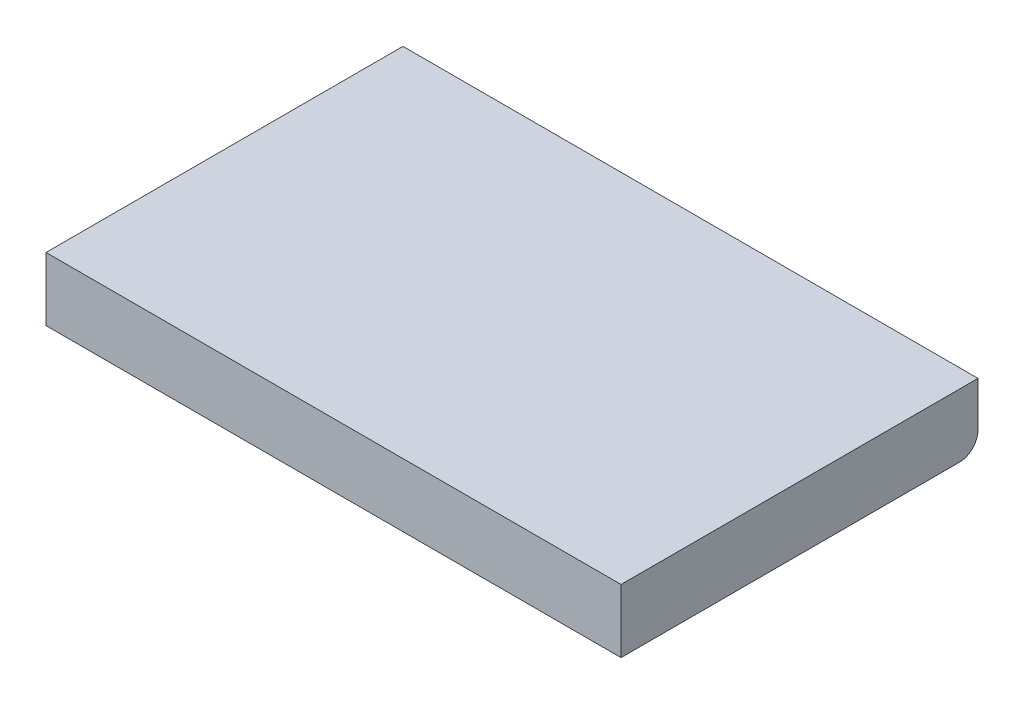
ISO-10303-21;
HEADER;
FILE_DESCRIPTION(('STEP AP214'),'2;1');
FILE_NAME('part.step','',(''),(''),'','','');
FILE_SCHEMA(('AUTOMOTIVE_DESIGN { 1 0 10303 214 1 1 1 1 }'));
ENDSEC;
DATA;
#1=APPLICATION_CONTEXT('core data for automotive mechanical design processes');
#2=APPLICATION_PROTOCOL_DEFINITION('international standard','automotive_design',2000,#1);
#3=PRODUCT_CONTEXT('',#1,'mechanical');
#4=PRODUCT('Part','Part','',(#3));
#5=PRODUCT_RELATED_PRODUCT_CATEGORY('part','',(#4));
#6=PRODUCT_DEFINITION_FORMATION('','',#4);
#7=PRODUCT_DEFINITION_CONTEXT('part definition',#1,'design');
#8=PRODUCT_DEFINITION('design','',#6,#7);
#9=PRODUCT_DEFINITION_SHAPE('','',#8);
#10=(LENGTH_UNIT() NAMED_UNIT(*) SI_UNIT(.MILLI.,.METRE.));
#11=(NAMED_UNIT(*) PLANE_ANGLE_UNIT() SI_UNIT($,.RADIAN.));
#12=(NAMED_UNIT(*) SI_UNIT($,.STERADIAN.) SOLID_ANGLE_UNIT());
#13=UNCERTAINTY_MEASURE_WITH_UNIT(LENGTH_MEASURE(1.E-05),#10,'distance_accuracy_value','');
#14=(GEOMETRIC_REPRESENTATION_CONTEXT(3) GLOBAL_UNCERTAINTY_ASSIGNED_CONTEXT((#13)) GLOBAL_UNIT_ASSIGNED_CONTEXT((#10,
#11,#12)) REPRESENTATION_CONTEXT('',''));
#15=CARTESIAN_POINT('',(0.,0.,0.));
#16=DIRECTION('',(0.,0.,1.));
#17=DIRECTION('',(1.,0.,0.));
#18=AXIS2_PLACEMENT_3D('',#15,#16,#17);
#19=CARTESIAN_POINT('',(0.,0.,0.));
#20=DIRECTION('',(0.,1.,0.));
#21=DIRECTION('',(0.,0.,1.));
#22=AXIS2_PLACEMENT_3D('',#19,#20,#21);
#23=PLANE('',#22);
#24=DIRECTION('',(-1.,0.,0.));
#25=VECTOR('',#24,1.);
#26=CARTESIAN_POINT('',(-72.750000042,0.,42.749999971));
#27=LINE('',#26,#25);
#28=CARTESIAN_POINT('',(72.750000042,0.,42.749999971));
#29=VERTEX_POINT('',#28);
#30=CARTESIAN_POINT('',(-72.750000042,0.,42.749999971));
#31=VERTEX_POINT('',#30);
#32=EDGE_CURVE('E207',#29,#31,#27,.T.);
#33=ORIENTED_EDGE('',*,*,#32,.T.);
#34=DIRECTION('',(0.,0.,-1.));
#35=VECTOR('',#34,1.);
#36=CARTESIAN_POINT('',(-72.750000042,0.,49.099999971));
#37=LINE('',#36,#35);
#38=CARTESIAN_POINT('',(-72.750000042,0.,-49.100002066488));
#39=VERTEX_POINT('',#38);
#40=EDGE_CURVE('E195',#31,#39,#37,.T.);
#41=ORIENTED_EDGE('',*,*,#40,.T.);
#42=DIRECTION('',(-1.,0.,0.));
#43=VECTOR('',#42,1.);
#44=CARTESIAN_POINT('',(-79.100000042,0.,-49.099999971));
#45=LINE('',#44,#43);
#46=CARTESIAN_POINT('',(-47.096000042,0.,-49.099999971));
#47=VERTEX_POINT('',#46);
#48=EDGE_CURVE('E309',#47,#39,#45,.T.);
#49=ORIENTED_EDGE('',*,*,#48,.F.);
#50=DIRECTION('',(0.,0.,1.));
#51=VECTOR('',#50,1.);
#52=CARTESIAN_POINT('',(-47.096000042,4.89494865048932E-07,-49.1000041619761));
#53=LINE('',#52,#51);
#54=CARTESIAN_POINT('',(-47.096000042,4.89494865048932E-07,-42.7500041619761));
#55=VERTEX_POINT('',#54);
#56=EDGE_CURVE('E290',#47,#55,#53,.T.);
#57=ORIENTED_EDGE('',*,*,#56,.T.);
#58=DIRECTION('',(-1.,0.,0.));
#59=VECTOR('',#58,1.);
#60=CARTESIAN_POINT('',(-12.954,4.89494865048932E-07,-42.7500041619761));
#61=LINE('',#60,#59);
#62=CARTESIAN_POINT('',(-12.954,4.89494865048932E-07,-42.7500041619761));
#63=VERTEX_POINT('',#62);
#64=EDGE_CURVE('E305',#63,#55,#61,.T.);
#65=ORIENTED_EDGE('',*,*,#64,.F.);
#66=DIRECTION('',(0.,0.,1.));
#67=VECTOR('',#66,1.);
#68=CARTESIAN_POINT('',(-12.954,4.89494865048932E-07,-49.1000041619761));
#69=LINE('',#68,#67);
#70=CARTESIAN_POINT('',(-12.954,0.,-49.099999971));
#71=VERTEX_POINT('',#70);
#72=EDGE_CURVE('E274',#71,#63,#69,.T.);
#73=ORIENTED_EDGE('',*,*,#72,.F.);
#74=CARTESIAN_POINT('',(12.446,-3.53747845956052E-06,-49.0999987381638));
#75=VERTEX_POINT('',#74);
#76=EDGE_CURVE('E329',#75,#71,#45,.T.);
#77=ORIENTED_EDGE('',*,*,#76,.F.);
#78=DIRECTION('',(0.,0.,-1.));
#79=VECTOR('',#78,1.);
#80=CARTESIAN_POINT('',(12.446,0.,-45.9249975053276));
#81=LINE('',#80,#79);
#82=CARTESIAN_POINT('',(12.446,0.,-42.7499975053276));
#83=VERTEX_POINT('',#82);
#84=EDGE_CURVE('E371',#83,#75,#81,.T.);
#85=ORIENTED_EDGE('',*,*,#84,.F.);
#86=DIRECTION('',(1.,0.,0.));
#87=VECTOR('',#86,1.);
#88=CARTESIAN_POINT('',(0.,0.,-42.7499975053276));
#89=LINE('',#88,#87);
#90=CARTESIAN_POINT('',(47.096000042,-3.53747845956052E-06,-42.7499975053276));
#91=VERTEX_POINT('',#90);
#92=EDGE_CURVE('E269',#83,#91,#89,.T.);
#93=ORIENTED_EDGE('',*,*,#92,.T.);
#94=DIRECTION('',(0.,0.,-1.));
#95=VECTOR('',#94,1.);
#96=CARTESIAN_POINT('',(47.096000042,-7.07495691912104E-06,-42.7499975053276));
#97=LINE('',#96,#95);
#98=CARTESIAN_POINT('',(47.096000042,0.,-49.099999971));
#99=VERTEX_POINT('',#98);
#100=EDGE_CURVE('E379',#91,#99,#97,.T.);
#101=ORIENTED_EDGE('',*,*,#100,.T.);
#102=CARTESIAN_POINT('',(72.750000042,0.,-49.1000020664881));
#103=VERTEX_POINT('',#102);
#104=EDGE_CURVE('E315',#103,#99,#45,.T.);
#105=ORIENTED_EDGE('',*,*,#104,.F.);
#106=DIRECTION('',(0.,0.,1.));
#107=VECTOR('',#106,1.);
#108=CARTESIAN_POINT('',(72.750000042,0.,49.099999971));
#109=LINE('',#108,#107);
#110=EDGE_CURVE('E217',#103,#29,#109,.T.);
#111=ORIENTED_EDGE('',*,*,#110,.T.);
#112=EDGE_LOOP('',(#33,#41,#49,#57,#65,#73,#77,#85,#93,#101,#105,#111));
#113=FACE_BOUND('',#112,.T.);
#114=ADVANCED_FACE('F49',(#113),#23,.F.);
#115=CARTESIAN_POINT('',(-72.750000042,0.,0.));
#116=DIRECTION('',(1.,0.,0.));
#117=DIRECTION('',(0.,0.,-1.));
#118=AXIS2_PLACEMENT_3D('',#115,#116,#117);
#119=PLANE('',#118);
#120=CARTESIAN_POINT('',(-72.750000042,-5.53648145945701,-45.9250041619761));
#121=DIRECTION('',(-1.,0.,0.));
#122=DIRECTION('',(0.,0.,1.));
#123=AXIS2_PLACEMENT_3D('',#120,#121,#122);
#124=CIRCLE('',#123,1.651);
#125=CARTESIAN_POINT('',(-72.750000042,-5.53648145945701,-44.2740041619761));
#126=VERTEX_POINT('',#125);
#127=EDGE_CURVE('E197',#126,#126,#124,.T.);
#128=ORIENTED_EDGE('',*,*,#127,.T.);
#129=EDGE_LOOP('',(#128));
#130=FACE_BOUND('',#129,.T.);
#131=DIRECTION('',(0.,0.,1.));
#132=VECTOR('',#131,1.);
#133=CARTESIAN_POINT('',(-72.750000042,-11.08,49.099999971));
#134=LINE('',#133,#132);
#135=CARTESIAN_POINT('',(-72.750000042,-11.08,-44.019999971));
#136=VERTEX_POINT('',#135);
#137=CARTESIAN_POINT('',(-72.750000042,-11.08,42.749999971));
#138=VERTEX_POINT('',#137);
#139=EDGE_CURVE('E171',#136,#138,#134,.T.);
#140=ORIENTED_EDGE('',*,*,#139,.F.);
#141=CARTESIAN_POINT('',(-72.750000042,-6.00000000000001,-44.019999971));
#142=DIRECTION('',(1.,0.,0.));
#143=DIRECTION('',(0.,0.,-1.));
#144=AXIS2_PLACEMENT_3D('',#141,#142,#143);
#145=CIRCLE('',#144,5.08);
#146=CARTESIAN_POINT('',(-72.750000042,-6.00000000000001,-49.100002066488));
#147=VERTEX_POINT('',#146);
#148=EDGE_CURVE('E11',#136,#147,#145,.T.);
#149=ORIENTED_EDGE('',*,*,#148,.T.);
#150=DIRECTION('',(0.,-1.,0.));
#151=VECTOR('',#150,1.);
#152=CARTESIAN_POINT('',(-72.750000042,0.,-49.100002066488));
#153=LINE('',#152,#151);
#154=EDGE_CURVE('E182',#39,#147,#153,.T.);
#155=ORIENTED_EDGE('',*,*,#154,.F.);
#156=ORIENTED_EDGE('',*,*,#40,.F.);
#157=DIRECTION('',(0.,-1.,0.));
#158=VECTOR('',#157,1.);
#159=CARTESIAN_POINT('',(-72.750000042,0.,42.749999971));
#160=LINE('',#159,#158);
#161=EDGE_CURVE('E186',#31,#138,#160,.T.);
#162=ORIENTED_EDGE('',*,*,#161,.T.);
#163=EDGE_LOOP('',(#140,#149,#155,#156,#162));
#164=FACE_BOUND('',#163,.T.);
#165=ADVANCED_FACE('F193',(#130,#164),#119,.T.);
#166=CARTESIAN_POINT('',(72.750000042,0.,0.));
#167=DIRECTION('',(1.,0.,0.));
#168=DIRECTION('',(0.,0.,-1.));
#169=AXIS2_PLACEMENT_3D('',#166,#167,#168);
#170=PLANE('',#169);
#171=DIRECTION('',(0.,1.,0.));
#172=VECTOR('',#171,1.);
#173=CARTESIAN_POINT('',(72.750000042,0.,-49.1000020664881));
#174=LINE('',#173,#172);
#175=CARTESIAN_POINT('',(72.750000042,-6.00000000000001,-49.1000020664881));
#176=VERTEX_POINT('',#175);
#177=EDGE_CURVE('E214',#176,#103,#174,.T.);
#178=ORIENTED_EDGE('',*,*,#177,.F.);
#179=CARTESIAN_POINT('',(72.750000042,-6.00000000000001,-44.019999971));
#180=DIRECTION('',(1.,0.,0.));
#181=DIRECTION('',(0.,0.,-1.));
#182=AXIS2_PLACEMENT_3D('',#179,#180,#181);
#183=CIRCLE('',#182,5.08);
#184=CARTESIAN_POINT('',(72.750000042,-11.08,-44.019999971));
#185=VERTEX_POINT('',#184);
#186=EDGE_CURVE('E347',#176,#185,#183,.F.);
#187=ORIENTED_EDGE('',*,*,#186,.T.);
#188=DIRECTION('',(0.,0.,-1.));
#189=VECTOR('',#188,1.);
#190=CARTESIAN_POINT('',(72.750000042,-11.08,49.099999971));
#191=LINE('',#190,#189);
#192=CARTESIAN_POINT('',(72.750000042,-11.08,42.749999971));
#193=VERTEX_POINT('',#192);
#194=EDGE_CURVE('E211',#193,#185,#191,.T.);
#195=ORIENTED_EDGE('',*,*,#194,.F.);
#196=DIRECTION('',(0.,1.,0.));
#197=VECTOR('',#196,1.);
#198=CARTESIAN_POINT('',(72.750000042,0.,42.749999971));
#199=LINE('',#198,#197);
#200=EDGE_CURVE('E189',#193,#29,#199,.T.);
#201=ORIENTED_EDGE('',*,*,#200,.T.);
#202=ORIENTED_EDGE('',*,*,#110,.F.);
#203=EDGE_LOOP('',(#178,#187,#195,#201,#202));
#204=FACE_BOUND('',#203,.T.);
#205=ADVANCED_FACE('F418',(#204),#170,.F.);
#206=CARTESIAN_POINT('',(79.100000042,6.35,-49.099999971));
#207=DIRECTION('',(-1.,0.,0.));
#208=DIRECTION('',(0.,0.,1.));
#209=AXIS2_PLACEMENT_3D('',#206,#207,#208);
#210=PLANE('',#209);
#211=DIRECTION('',(0.,0.,-1.));
#212=VECTOR('',#211,1.);
#213=CARTESIAN_POINT('',(79.100000042,-11.08,49.099999971));
#214=LINE('',#213,#212);
#215=CARTESIAN_POINT('',(79.100000042,-11.08,49.099999971));
#216=VERTEX_POINT('',#215);
#217=CARTESIAN_POINT('',(79.100000042,-11.08,-44.019999971));
#218=VERTEX_POINT('',#217);
#219=EDGE_CURVE('E210',#216,#218,#214,.T.);
#220=ORIENTED_EDGE('',*,*,#219,.T.);
#221=CARTESIAN_POINT('',(79.100000042,-6.00000000000001,-44.019999971));
#222=DIRECTION('',(-1.,0.,0.));
#223=DIRECTION('',(0.,0.,1.));
#224=AXIS2_PLACEMENT_3D('',#221,#222,#223);
#225=CIRCLE('',#224,5.08);
#226=CARTESIAN_POINT('',(79.100000042,-6.00000000000001,-49.099999971));
#227=VERTEX_POINT('',#226);
#228=EDGE_CURVE('E340',#218,#227,#225,.F.);
#229=ORIENTED_EDGE('',*,*,#228,.T.);
#230=DIRECTION('',(0.,-1.,0.));
#231=VECTOR('',#230,1.);
#232=CARTESIAN_POINT('',(79.100000042,6.35,-49.099999971));
#233=LINE('',#232,#231);
#234=CARTESIAN_POINT('',(79.100000042,6.35,-49.099999971));
#235=VERTEX_POINT('',#234);
#236=EDGE_CURVE('E341',#235,#227,#233,.T.);
#237=ORIENTED_EDGE('',*,*,#236,.F.);
#238=DIRECTION('',(0.,0.,-1.));
#239=VECTOR('',#238,1.);
#240=CARTESIAN_POINT('',(79.100000042,6.35,-49.099999971));
#241=LINE('',#240,#239);
#242=CARTESIAN_POINT('',(79.100000042,6.35,49.099999971));
#243=VERTEX_POINT('',#242);
#244=EDGE_CURVE('E310',#243,#235,#241,.T.);
#245=ORIENTED_EDGE('',*,*,#244,.F.);
#246=DIRECTION('',(0.,-1.,0.));
#247=VECTOR('',#246,1.);
#248=CARTESIAN_POINT('',(79.100000042,6.35,49.099999971));
#249=LINE('',#248,#247);
#250=EDGE_CURVE('E324',#243,#216,#249,.T.);
#251=ORIENTED_EDGE('',*,*,#250,.T.);
#252=EDGE_LOOP('',(#220,#229,#237,#245,#251));
#253=FACE_BOUND('',#252,.T.);
#254=ADVANCED_FACE('F467',(#253),#210,.F.);
#255=CARTESIAN_POINT('',(-79.100000042,6.35,-49.099999971));
#256=DIRECTION('',(0.,0.,1.));
#257=DIRECTION('',(1.,0.,0.));
#258=AXIS2_PLACEMENT_3D('',#255,#256,#257);
#259=PLANE('',#258);
#260=ORIENTED_EDGE('',*,*,#154,.T.);
#261=DIRECTION('',(-1.,0.,0.));
#262=VECTOR('',#261,1.);
#263=CARTESIAN_POINT('',(-79.100000042,-6.00000000000001,-49.099999971));
#264=LINE('',#263,#262);
#265=CARTESIAN_POINT('',(-79.100000042,-6.00000000000001,-49.099999971));
#266=VERTEX_POINT('',#265);
#267=EDGE_CURVE('E350',#147,#266,#264,.T.);
#268=ORIENTED_EDGE('',*,*,#267,.T.);
#269=DIRECTION('',(0.,-1.,0.));
#270=VECTOR('',#269,1.);
#271=CARTESIAN_POINT('',(-79.100000042,6.35,-49.099999971));
#272=LINE('',#271,#270);
#273=CARTESIAN_POINT('',(-79.100000042,6.35,-49.099999971));
#274=VERTEX_POINT('',#273);
#275=EDGE_CURVE('E359',#274,#266,#272,.T.);
#276=ORIENTED_EDGE('',*,*,#275,.F.);
#277=DIRECTION('',(-1.,0.,0.));
#278=VECTOR('',#277,1.);
#279=CARTESIAN_POINT('',(-79.100000042,6.35,-49.099999971));
#280=LINE('',#279,#278);
#281=EDGE_CURVE('E314',#235,#274,#280,.T.);
#282=ORIENTED_EDGE('',*,*,#281,.F.);
#283=ORIENTED_EDGE('',*,*,#236,.T.);
#284=DIRECTION('',(1.,0.,0.));
#285=VECTOR('',#284,1.);
#286=CARTESIAN_POINT('',(72.750000042,-6.00000000000001,-49.099999971));
#287=LINE('',#286,#285);
#288=EDGE_CURVE('E344',#227,#176,#287,.F.);
#289=ORIENTED_EDGE('',*,*,#288,.T.);
#290=ORIENTED_EDGE('',*,*,#177,.T.);
#291=ORIENTED_EDGE('',*,*,#104,.T.);
#292=DIRECTION('',(0.,-1.,0.));
#293=VECTOR('',#292,1.);
#294=CARTESIAN_POINT('',(47.096000042,-7.07495691912104E-06,-49.0999975053276));
#295=LINE('',#294,#293);
#296=CARTESIAN_POINT('',(47.096000042,-2.79966746332579,-49.0999975053276));
#297=VERTEX_POINT('',#296);
#298=EDGE_CURVE('E261',#99,#297,#295,.T.);
#299=ORIENTED_EDGE('',*,*,#298,.T.);
#300=DIRECTION('',(1.,0.,0.));
#301=VECTOR('',#300,1.);
#302=CARTESIAN_POINT('',(12.446,-2.79966746332579,-49.0999975053276));
#303=LINE('',#302,#301);
#304=CARTESIAN_POINT('',(12.446,-2.79966746332579,-49.0999975053276));
#305=VERTEX_POINT('',#304);
#306=EDGE_CURVE('E265',#305,#297,#303,.T.);
#307=ORIENTED_EDGE('',*,*,#306,.F.);
#308=DIRECTION('',(0.,-1.,0.));
#309=VECTOR('',#308,1.);
#310=CARTESIAN_POINT('',(12.446,-7.07495691912104E-06,-49.0999975053276));
#311=LINE('',#310,#309);
#312=EDGE_CURVE('E256',#75,#305,#311,.T.);
#313=ORIENTED_EDGE('',*,*,#312,.F.);
#314=ORIENTED_EDGE('',*,*,#76,.T.);
#315=DIRECTION('',(0.,1.,0.));
#316=VECTOR('',#315,1.);
#317=CARTESIAN_POINT('',(-12.954,4.89494865048932E-07,-49.1000041619761));
#318=LINE('',#317,#316);
#319=CARTESIAN_POINT('',(-12.954,-2.799659898874,-49.1000041619761));
#320=VERTEX_POINT('',#319);
#321=EDGE_CURVE('E270',#320,#71,#318,.T.);
#322=ORIENTED_EDGE('',*,*,#321,.F.);
#323=DIRECTION('',(-1.,0.,0.));
#324=VECTOR('',#323,1.);
#325=CARTESIAN_POINT('',(-12.954,-2.799659898874,-49.1000041619761));
#326=LINE('',#325,#324);
#327=CARTESIAN_POINT('',(-47.096000042,-2.799659898874,-49.1000041619761));
#328=VERTEX_POINT('',#327);
#329=EDGE_CURVE('E285',#320,#328,#326,.T.);
#330=ORIENTED_EDGE('',*,*,#329,.T.);
#331=DIRECTION('',(0.,1.,0.));
#332=VECTOR('',#331,1.);
#333=CARTESIAN_POINT('',(-47.096000042,4.89494865048932E-07,-49.1000041619761));
#334=LINE('',#333,#332);
#335=EDGE_CURVE('E286',#328,#47,#334,.T.);
#336=ORIENTED_EDGE('',*,*,#335,.T.);
#337=ORIENTED_EDGE('',*,*,#48,.T.);
#338=EDGE_LOOP('',(#260,#268,#276,#282,#283,#289,#290,#291,#299,#307,#313,#314,#322,#330,#336,#337));
#339=FACE_BOUND('',#338,.T.);
#340=ADVANCED_FACE('F412',(#339),#259,.F.);
#341=CARTESIAN_POINT('',(-79.100000042,6.35,-49.099999971));
#342=DIRECTION('',(1.,0.,0.));
#343=DIRECTION('',(0.,0.,-1.));
#344=AXIS2_PLACEMENT_3D('',#341,#342,#343);
#345=PLANE('',#344);
#346=CARTESIAN_POINT('',(-79.100000042,-5.53648145945701,-45.9250041619761));
#347=DIRECTION('',(-1.,0.,0.));
#348=DIRECTION('',(0.,0.,1.));
#349=AXIS2_PLACEMENT_3D('',#346,#347,#348);
#350=CIRCLE('',#349,1.651);
#351=CARTESIAN_POINT('',(-79.100000042,-5.53648145945701,-44.2740041619761));
#352=VERTEX_POINT('',#351);
#353=EDGE_CURVE('E201',#352,#352,#350,.T.);
#354=ORIENTED_EDGE('',*,*,#353,.F.);
#355=EDGE_LOOP('',(#354));
#356=FACE_BOUND('',#355,.T.);
#357=ORIENTED_EDGE('',*,*,#275,.T.);
#358=CARTESIAN_POINT('',(-79.100000042,-6.00000000000001,-44.019999971));
#359=DIRECTION('',(1.,0.,0.));
#360=DIRECTION('',(0.,0.,-1.));
#361=AXIS2_PLACEMENT_3D('',#358,#359,#360);
#362=CIRCLE('',#361,5.08);
#363=CARTESIAN_POINT('',(-79.100000042,-11.08,-44.019999971));
#364=VERTEX_POINT('',#363);
#365=EDGE_CURVE('E72',#266,#364,#362,.F.);
#366=ORIENTED_EDGE('',*,*,#365,.T.);
#367=DIRECTION('',(0.,0.,1.));
#368=VECTOR('',#367,1.);
#369=CARTESIAN_POINT('',(-79.100000042,-11.08,49.099999971));
#370=LINE('',#369,#368);
#371=CARTESIAN_POINT('',(-79.100000042,-11.08,49.099999971));
#372=VERTEX_POINT('',#371);
#373=EDGE_CURVE('E221',#364,#372,#370,.T.);
#374=ORIENTED_EDGE('',*,*,#373,.T.);
#375=DIRECTION('',(0.,-1.,0.));
#376=VECTOR('',#375,1.);
#377=CARTESIAN_POINT('',(-79.100000042,6.35,49.099999971));
#378=LINE('',#377,#376);
#379=CARTESIAN_POINT('',(-79.100000042,6.35,49.099999971));
#380=VERTEX_POINT('',#379);
#381=EDGE_CURVE('E362',#380,#372,#378,.T.);
#382=ORIENTED_EDGE('',*,*,#381,.F.);
#383=DIRECTION('',(0.,0.,1.));
#384=VECTOR('',#383,1.);
#385=CARTESIAN_POINT('',(-79.100000042,6.35,-49.099999971));
#386=LINE('',#385,#384);
#387=EDGE_CURVE('E318',#274,#380,#386,.T.);
#388=ORIENTED_EDGE('',*,*,#387,.F.);
#389=EDGE_LOOP('',(#357,#366,#374,#382,#388));
#390=FACE_BOUND('',#389,.T.);
#391=ADVANCED_FACE('F460',(#356,#390),#345,.F.);
#392=CARTESIAN_POINT('',(-79.100000042,6.35,49.099999971));
#393=DIRECTION('',(0.,0.,-1.));
#394=DIRECTION('',(-1.,0.,0.));
#395=AXIS2_PLACEMENT_3D('',#392,#393,#394);
#396=PLANE('',#395);
#397=ORIENTED_EDGE('',*,*,#381,.T.);
#398=DIRECTION('',(-1.,0.,0.));
#399=VECTOR('',#398,1.);
#400=CARTESIAN_POINT('',(-72.750000042,-11.08,49.099999971));
#401=LINE('',#400,#399);
#402=EDGE_CURVE('E181',#216,#372,#401,.T.);
#403=ORIENTED_EDGE('',*,*,#402,.F.);
#404=ORIENTED_EDGE('',*,*,#250,.F.);
#405=DIRECTION('',(1.,0.,0.));
#406=VECTOR('',#405,1.);
#407=CARTESIAN_POINT('',(-79.100000042,6.35,49.099999971));
#408=LINE('',#407,#406);
#409=EDGE_CURVE('E321',#380,#243,#408,.T.);
#410=ORIENTED_EDGE('',*,*,#409,.F.);
#411=EDGE_LOOP('',(#397,#403,#404,#410));
#412=FACE_BOUND('',#411,.T.);
#413=ADVANCED_FACE('F457',(#412),#396,.F.);
#414=CARTESIAN_POINT('',(0.,6.35,0.));
#415=DIRECTION('',(0.,1.,0.));
#416=DIRECTION('',(0.,0.,1.));
#417=AXIS2_PLACEMENT_3D('',#414,#415,#416);
#418=PLANE('',#417);
#419=ORIENTED_EDGE('',*,*,#244,.T.);
#420=ORIENTED_EDGE('',*,*,#281,.T.);
#421=ORIENTED_EDGE('',*,*,#387,.T.);
#422=ORIENTED_EDGE('',*,*,#409,.T.);
#423=EDGE_LOOP('',(#419,#420,#421,#422));
#424=FACE_BOUND('',#423,.T.);
#425=ADVANCED_FACE('F445',(#424),#418,.T.);
#426=CARTESIAN_POINT('',(-12.954,4.89494865048932E-07,-42.7500041619761));
#427=DIRECTION('',(0.,0.,-1.));
#428=DIRECTION('',(-1.,0.,0.));
#429=AXIS2_PLACEMENT_3D('',#426,#427,#428);
#430=PLANE('',#429);
#431=DIRECTION('',(0.,-1.,0.));
#432=VECTOR('',#431,1.);
#433=CARTESIAN_POINT('',(-47.096000042,4.89494865048932E-07,-42.7500041619761));
#434=LINE('',#433,#432);
#435=CARTESIAN_POINT('',(-47.096000042,-2.799659898874,-42.7500041619761));
#436=VERTEX_POINT('',#435);
#437=EDGE_CURVE('E293',#55,#436,#434,.T.);
#438=ORIENTED_EDGE('',*,*,#437,.T.);
#439=DIRECTION('',(-1.,0.,0.));
#440=VECTOR('',#439,1.);
#441=CARTESIAN_POINT('',(-12.954,-2.799659898874,-42.7500041619761));
#442=LINE('',#441,#440);
#443=CARTESIAN_POINT('',(-12.954,-2.799659898874,-42.7500041619761));
#444=VERTEX_POINT('',#443);
#445=EDGE_CURVE('E301',#444,#436,#442,.T.);
#446=ORIENTED_EDGE('',*,*,#445,.F.);
#447=DIRECTION('',(0.,-1.,0.));
#448=VECTOR('',#447,1.);
#449=CARTESIAN_POINT('',(-12.954,4.89494865048932E-07,-42.7500041619761));
#450=LINE('',#449,#448);
#451=EDGE_CURVE('E279',#63,#444,#450,.T.);
#452=ORIENTED_EDGE('',*,*,#451,.F.);
#453=ORIENTED_EDGE('',*,*,#64,.T.);
#454=EDGE_LOOP('',(#438,#446,#452,#453));
#455=FACE_BOUND('',#454,.T.);
#456=ADVANCED_FACE('F430',(#455),#430,.F.);
#457=CARTESIAN_POINT('',(-12.954,-5.53648145945701,-45.9250041619761));
#458=DIRECTION('',(-1.,0.,0.));
#459=DIRECTION('',(0.,0.,1.));
#460=AXIS2_PLACEMENT_3D('',#457,#458,#459);
#461=CYLINDRICAL_SURFACE('',#460,4.1917558677089);
#462=CARTESIAN_POINT('',(-47.096000042,-5.53648145945701,-45.9250041619761));
#463=DIRECTION('',(1.,0.,0.));
#464=DIRECTION('',(0.,0.,-1.));
#465=AXIS2_PLACEMENT_3D('',#462,#463,#464);
#466=CIRCLE('',#465,4.1917558677089);
#467=EDGE_CURVE('E275',#436,#328,#466,.T.);
#468=ORIENTED_EDGE('',*,*,#467,.T.);
#469=ORIENTED_EDGE('',*,*,#329,.F.);
#470=CARTESIAN_POINT('',(-12.954,-5.53648145945701,-45.9250041619761));
#471=DIRECTION('',(1.,0.,0.));
#472=DIRECTION('',(0.,0.,-1.));
#473=AXIS2_PLACEMENT_3D('',#470,#471,#472);
#474=CIRCLE('',#473,4.1917558677089);
#475=EDGE_CURVE('E282',#444,#320,#474,.T.);
#476=ORIENTED_EDGE('',*,*,#475,.F.);
#477=ORIENTED_EDGE('',*,*,#445,.T.);
#478=EDGE_LOOP('',(#468,#469,#476,#477));
#479=FACE_BOUND('',#478,.T.);
#480=ADVANCED_FACE('F436',(#479),#461,.T.);
#481=CARTESIAN_POINT('',(-12.954,-5.53648145945701,-45.9250041619761));
#482=DIRECTION('',(1.,0.,0.));
#483=DIRECTION('',(0.,0.,-1.));
#484=AXIS2_PLACEMENT_3D('',#481,#482,#483);
#485=PLANE('',#484);
#486=CARTESIAN_POINT('',(-12.954,-5.53648145945701,-45.9250041619761));
#487=DIRECTION('',(-1.,0.,0.));
#488=DIRECTION('',(0.,0.,1.));
#489=AXIS2_PLACEMENT_3D('',#486,#487,#488);
#490=CIRCLE('',#489,1.651);
#491=CARTESIAN_POINT('',(-12.954,-5.53648145945701,-44.2740041619761));
#492=VERTEX_POINT('',#491);
#493=EDGE_CURVE('E236',#492,#492,#490,.T.);
#494=ORIENTED_EDGE('',*,*,#493,.T.);
#495=EDGE_LOOP('',(#494));
#496=FACE_BOUND('',#495,.T.);
#497=ORIENTED_EDGE('',*,*,#321,.T.);
#498=ORIENTED_EDGE('',*,*,#72,.T.);
#499=ORIENTED_EDGE('',*,*,#451,.T.);
#500=ORIENTED_EDGE('',*,*,#475,.T.);
#501=EDGE_LOOP('',(#497,#498,#499,#500));
#502=FACE_BOUND('',#501,.T.);
#503=ADVANCED_FACE('F434',(#496,#502),#485,.T.);
#504=CARTESIAN_POINT('',(-47.096000042,-5.53648145945701,-45.9250041619761));
#505=DIRECTION('',(1.,0.,0.));
#506=DIRECTION('',(0.,0.,-1.));
#507=AXIS2_PLACEMENT_3D('',#504,#505,#506);
#508=PLANE('',#507);
#509=CARTESIAN_POINT('',(-47.096000042,-5.53648145945701,-45.9250041619761));
#510=DIRECTION('',(-1.,0.,0.));
#511=DIRECTION('',(0.,0.,1.));
#512=AXIS2_PLACEMENT_3D('',#509,#510,#511);
#513=CIRCLE('',#512,1.651);
#514=CARTESIAN_POINT('',(-47.096000042,-5.53648145945701,-44.2740041619761));
#515=VERTEX_POINT('',#514);
#516=EDGE_CURVE('E235',#515,#515,#513,.T.);
#517=ORIENTED_EDGE('',*,*,#516,.F.);
#518=EDGE_LOOP('',(#517));
#519=FACE_BOUND('',#518,.T.);
#520=ORIENTED_EDGE('',*,*,#335,.F.);
#521=ORIENTED_EDGE('',*,*,#467,.F.);
#522=ORIENTED_EDGE('',*,*,#437,.F.);
#523=ORIENTED_EDGE('',*,*,#56,.F.);
#524=EDGE_LOOP('',(#520,#521,#522,#523));
#525=FACE_BOUND('',#524,.T.);
#526=ADVANCED_FACE('F426',(#519,#525),#508,.F.);
#527=CARTESIAN_POINT('',(12.446,-7.07495691912104E-06,-42.7499975053276));
#528=DIRECTION('',(0.,0.,-1.));
#529=DIRECTION('',(-1.,0.,0.));
#530=AXIS2_PLACEMENT_3D('',#527,#528,#529);
#531=PLANE('',#530);
#532=DIRECTION('',(0.,1.,0.));
#533=VECTOR('',#532,1.);
#534=CARTESIAN_POINT('',(47.096000042,-7.07495691912104E-06,-42.7499975053276));
#535=LINE('',#534,#533);
#536=CARTESIAN_POINT('',(47.096000042,-2.79966746332578,-42.7499975053276));
#537=VERTEX_POINT('',#536);
#538=EDGE_CURVE('E251',#537,#91,#535,.T.);
#539=ORIENTED_EDGE('',*,*,#538,.T.);
#540=ORIENTED_EDGE('',*,*,#92,.F.);
#541=DIRECTION('',(0.,1.,0.));
#542=VECTOR('',#541,1.);
#543=CARTESIAN_POINT('',(12.446,-7.07495691912104E-06,-42.7499975053276));
#544=LINE('',#543,#542);
#545=CARTESIAN_POINT('',(12.446,-2.79966746332578,-42.7499975053276));
#546=VERTEX_POINT('',#545);
#547=EDGE_CURVE('E260',#546,#83,#544,.T.);
#548=ORIENTED_EDGE('',*,*,#547,.F.);
#549=DIRECTION('',(1.,0.,0.));
#550=VECTOR('',#549,1.);
#551=CARTESIAN_POINT('',(12.446,-2.79966746332578,-42.7499975053276));
#552=LINE('',#551,#550);
#553=EDGE_CURVE('E255',#546,#537,#552,.T.);
#554=ORIENTED_EDGE('',*,*,#553,.T.);
#555=EDGE_LOOP('',(#539,#540,#548,#554));
#556=FACE_BOUND('',#555,.T.);
#557=ADVANCED_FACE('F393',(#556),#531,.F.);
#558=CARTESIAN_POINT('',(12.446,-5.53648902390879,-45.9249975053276));
#559=DIRECTION('',(1.,0.,0.));
#560=DIRECTION('',(0.,0.,-1.));
#561=AXIS2_PLACEMENT_3D('',#558,#559,#560);
#562=CYLINDRICAL_SURFACE('',#561,4.1917558677089);
#563=CARTESIAN_POINT('',(47.096000042,-5.53648902390879,-45.9249975053276));
#564=DIRECTION('',(-1.,0.,0.));
#565=DIRECTION('',(0.,0.,1.));
#566=AXIS2_PLACEMENT_3D('',#563,#564,#565);
#567=CIRCLE('',#566,4.1917558677089);
#568=EDGE_CURVE('E257',#297,#537,#567,.T.);
#569=ORIENTED_EDGE('',*,*,#568,.T.);
#570=ORIENTED_EDGE('',*,*,#553,.F.);
#571=CARTESIAN_POINT('',(12.446,-5.53648902390879,-45.9249975053276));
#572=DIRECTION('',(-1.,0.,0.));
#573=DIRECTION('',(0.,0.,1.));
#574=AXIS2_PLACEMENT_3D('',#571,#572,#573);
#575=CIRCLE('',#574,4.1917558677089);
#576=EDGE_CURVE('E252',#305,#546,#575,.T.);
#577=ORIENTED_EDGE('',*,*,#576,.F.);
#578=ORIENTED_EDGE('',*,*,#306,.T.);
#579=EDGE_LOOP('',(#569,#570,#577,#578));
#580=FACE_BOUND('',#579,.T.);
#581=ADVANCED_FACE('F410',(#580),#562,.T.);
#582=CARTESIAN_POINT('',(12.446,-5.53648902390879,-45.9249975053276));
#583=DIRECTION('',(-1.,0.,0.));
#584=DIRECTION('',(0.,0.,1.));
#585=AXIS2_PLACEMENT_3D('',#582,#583,#584);
#586=PLANE('',#585);
#587=CARTESIAN_POINT('',(12.446,-5.53648902390879,-45.9249975053276));
#588=DIRECTION('',(-1.,0.,0.));
#589=DIRECTION('',(0.,0.,1.));
#590=AXIS2_PLACEMENT_3D('',#587,#588,#589);
#591=CIRCLE('',#590,1.651);
#592=CARTESIAN_POINT('',(12.446,-5.53648902390879,-47.5759975053276));
#593=VERTEX_POINT('',#592);
#594=EDGE_CURVE('E247',#593,#593,#591,.T.);
#595=ORIENTED_EDGE('',*,*,#594,.F.);
#596=EDGE_LOOP('',(#595));
#597=FACE_BOUND('',#596,.T.);
#598=ORIENTED_EDGE('',*,*,#547,.T.);
#599=ORIENTED_EDGE('',*,*,#84,.T.);
#600=ORIENTED_EDGE('',*,*,#312,.T.);
#601=ORIENTED_EDGE('',*,*,#576,.T.);
#602=EDGE_LOOP('',(#598,#599,#600,#601));
#603=FACE_BOUND('',#602,.T.);
#604=ADVANCED_FACE('F406',(#597,#603),#586,.T.);
#605=CARTESIAN_POINT('',(47.096000042,-5.53648902390879,-45.9249975053276));
#606=DIRECTION('',(-1.,0.,0.));
#607=DIRECTION('',(0.,0.,1.));
#608=AXIS2_PLACEMENT_3D('',#605,#606,#607);
#609=PLANE('',#608);
#610=CARTESIAN_POINT('',(47.096000042,-5.53648902390879,-45.9249975053276));
#611=DIRECTION('',(1.,0.,0.));
#612=DIRECTION('',(0.,0.,-1.));
#613=AXIS2_PLACEMENT_3D('',#610,#611,#612);
#614=CIRCLE('',#613,1.651);
#615=CARTESIAN_POINT('',(47.096000042,-5.53648902390879,-47.5759975053276));
#616=VERTEX_POINT('',#615);
#617=EDGE_CURVE('E240',#616,#616,#614,.T.);
#618=ORIENTED_EDGE('',*,*,#617,.F.);
#619=EDGE_LOOP('',(#618));
#620=FACE_BOUND('',#619,.T.);
#621=ORIENTED_EDGE('',*,*,#538,.F.);
#622=ORIENTED_EDGE('',*,*,#568,.F.);
#623=ORIENTED_EDGE('',*,*,#298,.F.);
#624=ORIENTED_EDGE('',*,*,#100,.F.);
#625=EDGE_LOOP('',(#621,#622,#623,#624));
#626=FACE_BOUND('',#625,.T.);
#627=ADVANCED_FACE('F399',(#620,#626),#609,.F.);
#628=CARTESIAN_POINT('',(8.996000042,-5.53648902390879,-45.9249975053276));
#629=DIRECTION('',(1.,0.,0.));
#630=DIRECTION('',(0.,0.,-1.));
#631=AXIS2_PLACEMENT_3D('',#628,#629,#630);
#632=CYLINDRICAL_SURFACE('',#631,1.651);
#633=CARTESIAN_POINT('',(12.446,-5.53648902390879,-47.5759975053276));
#634=CARTESIAN_POINT('',(12.8069375004375,-5.53648902390879,-47.5759975053276));
#635=CARTESIAN_POINT('',(13.167875000875,-5.53648902390879,-47.5759975053276));
#636=CARTESIAN_POINT('',(13.88975000175,-5.53648902390879,-47.5759975053276));
#637=CARTESIAN_POINT('',(14.2506875021875,-5.53648902390879,-47.5759975053276));
#638=CARTESIAN_POINT('',(14.9725625030625,-5.53648902390879,-47.5759975053276));
#639=CARTESIAN_POINT('',(15.3335000035,-5.53648902390879,-47.5759975053276));
#640=CARTESIAN_POINT('',(16.055375004375,-5.53648902390879,-47.5759975053276));
#641=CARTESIAN_POINT('',(16.4163125048125,-5.53648902390879,-47.5759975053276));
#642=CARTESIAN_POINT('',(17.1381875056875,-5.53648902390879,-47.5759975053276));
#643=CARTESIAN_POINT('',(17.499125006125,-5.53648902390879,-47.5759975053276));
#644=CARTESIAN_POINT('',(18.221000007,-5.53648902390879,-47.5759975053276));
#645=CARTESIAN_POINT('',(18.5819375074375,-5.53648902390879,-47.5759975053276));
#646=CARTESIAN_POINT('',(19.3038125083125,-5.53648902390879,-47.5759975053276));
#647=CARTESIAN_POINT('',(19.66475000875,-5.53648902390879,-47.5759975053276));
#648=CARTESIAN_POINT('',(20.386625009625,-5.53648902390879,-47.5759975053276));
#649=CARTESIAN_POINT('',(20.7475625100625,-5.53648902390879,-47.5759975053276));
#650=CARTESIAN_POINT('',(21.4694375109375,-5.53648902390879,-47.5759975053276));
#651=CARTESIAN_POINT('',(21.830375011375,-5.53648902390879,-47.5759975053276));
#652=CARTESIAN_POINT('',(22.55225001225,-5.53648902390879,-47.5759975053276));
#653=CARTESIAN_POINT('',(22.9131875126875,-5.53648902390879,-47.5759975053276));
#654=CARTESIAN_POINT('',(23.6350625135625,-5.53648902390879,-47.5759975053276));
#655=CARTESIAN_POINT('',(23.996000014,-5.53648902390879,-47.5759975053276));
#656=CARTESIAN_POINT('',(24.717875014875,-5.53648902390879,-47.5759975053276));
#657=CARTESIAN_POINT('',(25.0788125153125,-5.53648902390879,-47.5759975053276));
#658=CARTESIAN_POINT('',(25.8006875161875,-5.53648902390879,-47.5759975053276));
#659=CARTESIAN_POINT('',(26.161625016625,-5.53648902390879,-47.5759975053276));
#660=CARTESIAN_POINT('',(26.8835000175,-5.53648902390879,-47.5759975053276));
#661=CARTESIAN_POINT('',(27.2444375179375,-5.53648902390879,-47.5759975053276));
#662=CARTESIAN_POINT('',(27.9663125188125,-5.53648902390879,-47.5759975053276));
#663=CARTESIAN_POINT('',(28.32725001925,-5.53648902390879,-47.5759975053276));
#664=CARTESIAN_POINT('',(29.049125020125,-5.53648902390879,-47.5759975053276));
#665=CARTESIAN_POINT('',(29.4100625205625,-5.53648902390879,-47.5759975053276));
#666=CARTESIAN_POINT('',(30.1319375214375,-5.53648902390879,-47.5759975053276));
#667=CARTESIAN_POINT('',(30.492875021875,-5.53648902390879,-47.5759975053276));
#668=CARTESIAN_POINT('',(31.21475002275,-5.53648902390879,-47.5759975053276));
#669=CARTESIAN_POINT('',(31.5756875231875,-5.53648902390879,-47.5759975053276));
#670=CARTESIAN_POINT('',(32.2975625240625,-5.53648902390879,-47.5759975053276));
#671=CARTESIAN_POINT('',(32.6585000245,-5.53648902390879,-47.5759975053276));
#672=CARTESIAN_POINT('',(33.380375025375,-5.53648902390879,-47.5759975053276));
#673=CARTESIAN_POINT('',(33.7413125258125,-5.53648902390879,-47.5759975053276));
#674=CARTESIAN_POINT('',(34.4631875266875,-5.53648902390879,-47.5759975053276));
#675=CARTESIAN_POINT('',(34.824125027125,-5.53648902390879,-47.5759975053276));
#676=CARTESIAN_POINT('',(35.546000028,-5.53648902390879,-47.5759975053276));
#677=CARTESIAN_POINT('',(35.9069375284375,-5.53648902390879,-47.5759975053276));
#678=CARTESIAN_POINT('',(36.6288125293125,-5.53648902390879,-47.5759975053276));
#679=CARTESIAN_POINT('',(36.98975002975,-5.53648902390879,-47.5759975053276));
#680=CARTESIAN_POINT('',(37.711625030625,-5.53648902390879,-47.5759975053276));
#681=CARTESIAN_POINT('',(38.0725625310625,-5.53648902390879,-47.5759975053276));
#682=CARTESIAN_POINT('',(38.7944375319375,-5.53648902390879,-47.5759975053276));
#683=CARTESIAN_POINT('',(39.155375032375,-5.53648902390879,-47.5759975053276));
#684=CARTESIAN_POINT('',(39.87725003325,-5.53648902390879,-47.5759975053276));
#685=CARTESIAN_POINT('',(40.2381875336875,-5.53648902390879,-47.5759975053276));
#686=CARTESIAN_POINT('',(40.9600625345625,-5.53648902390879,-47.5759975053276));
#687=CARTESIAN_POINT('',(41.321000035,-5.53648902390879,-47.5759975053276));
#688=CARTESIAN_POINT('',(42.042875035875,-5.53648902390879,-47.5759975053276));
#689=CARTESIAN_POINT('',(42.4038125363125,-5.53648902390879,-47.5759975053276));
#690=CARTESIAN_POINT('',(43.1256875371875,-5.53648902390879,-47.5759975053276));
#691=CARTESIAN_POINT('',(43.486625037625,-5.53648902390879,-47.5759975053276));
#692=CARTESIAN_POINT('',(44.2085000385,-5.53648902390879,-47.5759975053276));
#693=CARTESIAN_POINT('',(44.5694375389375,-5.53648902390879,-47.5759975053276));
#694=CARTESIAN_POINT('',(45.2913125398125,-5.53648902390879,-47.5759975053276));
#695=CARTESIAN_POINT('',(45.65225004025,-5.53648902390879,-47.5759975053276));
#696=CARTESIAN_POINT('',(46.374125041125,-5.53648902390879,-47.5759975053276));
#697=CARTESIAN_POINT('',(46.7350625415625,-5.53648902390879,-47.5759975053276));
#698=CARTESIAN_POINT('',(47.096000042,-5.53648902390879,-47.5759975053276));
#699=B_SPLINE_CURVE_WITH_KNOTS('',3,(#633,#634,#635,#636,#637,#638,#639,#640,#641,#642,#643,
#644,#645,#646,#647,#648,#649,#650,#651,#652,#653,#654,#655,#656,#657,#658,#659,#660,#661,#662,
#663,#664,#665,#666,#667,#668,#669,#670,#671,#672,#673,#674,#675,#676,#677,#678,#679,#680,#681,
#682,#683,#684,#685,#686,#687,#688,#689,#690,#691,#692,#693,#694,#695,#696,#697,#698),
.UNSPECIFIED.,.F.,.F.,(4,2,2,2,2,2,2,2,2,2,2,2,2,2,2,2,2,2,2,2,2,2,2,2,2,2,2,2,2,2,2,2,4),(0.,
1.0828125013125,2.165625002625,3.2484375039375,4.33125000525,5.4140625065625,6.496875007875,
7.5796875091875,8.6625000105,9.7453125118125,10.828125013125,11.9109375144375,12.99375001575,
14.0765625170625,15.159375018375,16.2421875196875,17.325000021,18.4078125223125,19.490625023625,
20.5734375249375,21.65625002625,22.7390625275625,23.821875028875,24.9046875301875,25.9875000315,
27.0703125328125,28.153125034125,29.2359375354375,30.31875003675,31.4015625380625,
32.484375039375,33.5671875406875,34.650000042),.UNSPECIFIED.);
#700=EDGE_CURVE('BSEAM553',#593,#616,#699,.T.);
#701=ORIENTED_EDGE('',*,*,#594,.T.);
#702=ORIENTED_EDGE('',*,*,#617,.T.);
#703=ORIENTED_EDGE('',*,*,#700,.T.);
#704=ORIENTED_EDGE('',*,*,#700,.F.);
#705=EDGE_LOOP('',(#701,#703,#702,#704));
#706=FACE_BOUND('',#705,.T.);
#707=ADVANCED_FACE('F553',(#706),#632,.F.);
#708=CARTESIAN_POINT('',(-12.954,-5.53648145945701,-45.9250041619761));
#709=DIRECTION('',(-1.,0.,0.));
#710=DIRECTION('',(0.,0.,1.));
#711=AXIS2_PLACEMENT_3D('',#708,#709,#710);
#712=CYLINDRICAL_SURFACE('',#711,1.651);
#713=ORIENTED_EDGE('',*,*,#493,.F.);
#714=EDGE_LOOP('',(#713));
#715=FACE_BOUND('',#714,.T.);
#716=ORIENTED_EDGE('',*,*,#516,.T.);
#717=EDGE_LOOP('',(#716));
#718=FACE_BOUND('',#717,.T.);
#719=ADVANCED_FACE('F562',(#715,#718),#712,.F.);
#720=CARTESIAN_POINT('',(-72.750000042,-11.08,49.099999971));
#721=DIRECTION('',(0.,-1.,0.));
#722=DIRECTION('',(0.,0.,-1.));
#723=AXIS2_PLACEMENT_3D('',#720,#721,#722);
#724=PLANE('',#723);
#725=ORIENTED_EDGE('',*,*,#373,.F.);
#726=DIRECTION('',(-1.,0.,0.));
#727=VECTOR('',#726,1.);
#728=CARTESIAN_POINT('',(-72.750000042,-11.08,-44.019999971));
#729=LINE('',#728,#727);
#730=EDGE_CURVE('E58',#364,#136,#729,.F.);
#731=ORIENTED_EDGE('',*,*,#730,.T.);
#732=ORIENTED_EDGE('',*,*,#139,.T.);
#733=DIRECTION('',(1.,0.,0.));
#734=VECTOR('',#733,1.);
#735=CARTESIAN_POINT('',(-72.750000042,-11.08,42.749999971));
#736=LINE('',#735,#734);
#737=EDGE_CURVE('E175',#138,#193,#736,.T.);
#738=ORIENTED_EDGE('',*,*,#737,.T.);
#739=ORIENTED_EDGE('',*,*,#194,.T.);
#740=DIRECTION('',(1.,0.,0.));
#741=VECTOR('',#740,1.);
#742=CARTESIAN_POINT('',(79.100000042,-11.08,-44.019999971));
#743=LINE('',#742,#741);
#744=EDGE_CURVE('E336',#185,#218,#743,.T.);
#745=ORIENTED_EDGE('',*,*,#744,.T.);
#746=ORIENTED_EDGE('',*,*,#219,.F.);
#747=ORIENTED_EDGE('',*,*,#402,.T.);
#748=EDGE_LOOP('',(#725,#731,#732,#738,#739,#745,#746,#747));
#749=FACE_BOUND('',#748,.T.);
#750=ADVANCED_FACE('F173',(#749),#724,.T.);
#751=CARTESIAN_POINT('',(0.,0.,42.749999971));
#752=DIRECTION('',(0.,0.,1.));
#753=DIRECTION('',(1.,0.,0.));
#754=AXIS2_PLACEMENT_3D('',#751,#752,#753);
#755=PLANE('',#754);
#756=ORIENTED_EDGE('',*,*,#161,.F.);
#757=ORIENTED_EDGE('',*,*,#32,.F.);
#758=ORIENTED_EDGE('',*,*,#200,.F.);
#759=ORIENTED_EDGE('',*,*,#737,.F.);
#760=EDGE_LOOP('',(#756,#757,#758,#759));
#761=FACE_BOUND('',#760,.T.);
#762=ADVANCED_FACE('F185',(#761),#755,.F.);
#763=CARTESIAN_POINT('',(-72.750000042,-6.00000000000001,-44.019999971));
#764=DIRECTION('',(-1.,0.,0.));
#765=DIRECTION('',(0.,-1.,0.));
#766=AXIS2_PLACEMENT_3D('',#763,#764,#765);
#767=CYLINDRICAL_SURFACE('',#766,5.08);
#768=ORIENTED_EDGE('',*,*,#186,.F.);
#769=ORIENTED_EDGE('',*,*,#288,.F.);
#770=ORIENTED_EDGE('',*,*,#228,.F.);
#771=ORIENTED_EDGE('',*,*,#744,.F.);
#772=EDGE_LOOP('',(#768,#769,#770,#771));
#773=FACE_BOUND('',#772,.T.);
#774=ADVANCED_FACE('F470',(#773),#767,.T.);
#775=CARTESIAN_POINT('',(-79.100000042,-6.00000000000001,-44.019999971));
#776=DIRECTION('',(1.,0.,0.));
#777=DIRECTION('',(0.,1.,0.));
#778=AXIS2_PLACEMENT_3D('',#775,#776,#777);
#779=CYLINDRICAL_SURFACE('',#778,5.08);
#780=ORIENTED_EDGE('',*,*,#148,.F.);
#781=ORIENTED_EDGE('',*,*,#730,.F.);
#782=ORIENTED_EDGE('',*,*,#365,.F.);
#783=ORIENTED_EDGE('',*,*,#267,.F.);
#784=EDGE_LOOP('',(#780,#781,#782,#783));
#785=FACE_BOUND('',#784,.T.);
#786=ADVANCED_FACE('F51',(#785),#779,.T.);
#787=CARTESIAN_POINT('',(-72.750000042,-5.53648145945701,-45.9250041619761));
#788=DIRECTION('',(-1.,0.,0.));
#789=DIRECTION('',(0.,0.,1.));
#790=AXIS2_PLACEMENT_3D('',#787,#788,#789);
#791=CYLINDRICAL_SURFACE('',#790,1.651);
#792=ORIENTED_EDGE('',*,*,#127,.F.);
#793=EDGE_LOOP('',(#792));
#794=FACE_BOUND('',#793,.T.);
#795=ORIENTED_EDGE('',*,*,#353,.T.);
#796=EDGE_LOOP('',(#795));
#797=FACE_BOUND('',#796,.T.);
#798=ADVANCED_FACE('F477',(#794,#797),#791,.F.);
#799=CLOSED_SHELL('',(#114,#165,#205,#254,#340,#391,#413,#425,#456,#480,#503,#526,#557,#581,
#604,#627,#707,#719,#750,#762,#774,#786,#798));
#800=MANIFOLD_SOLID_BREP('B2',#799);
#801=ADVANCED_BREP_SHAPE_REPRESENTATION('',(#18,#800),#14);
#802=SHAPE_DEFINITION_REPRESENTATION(#9,#801);
ENDSEC;
END-ISO-10303-21;
